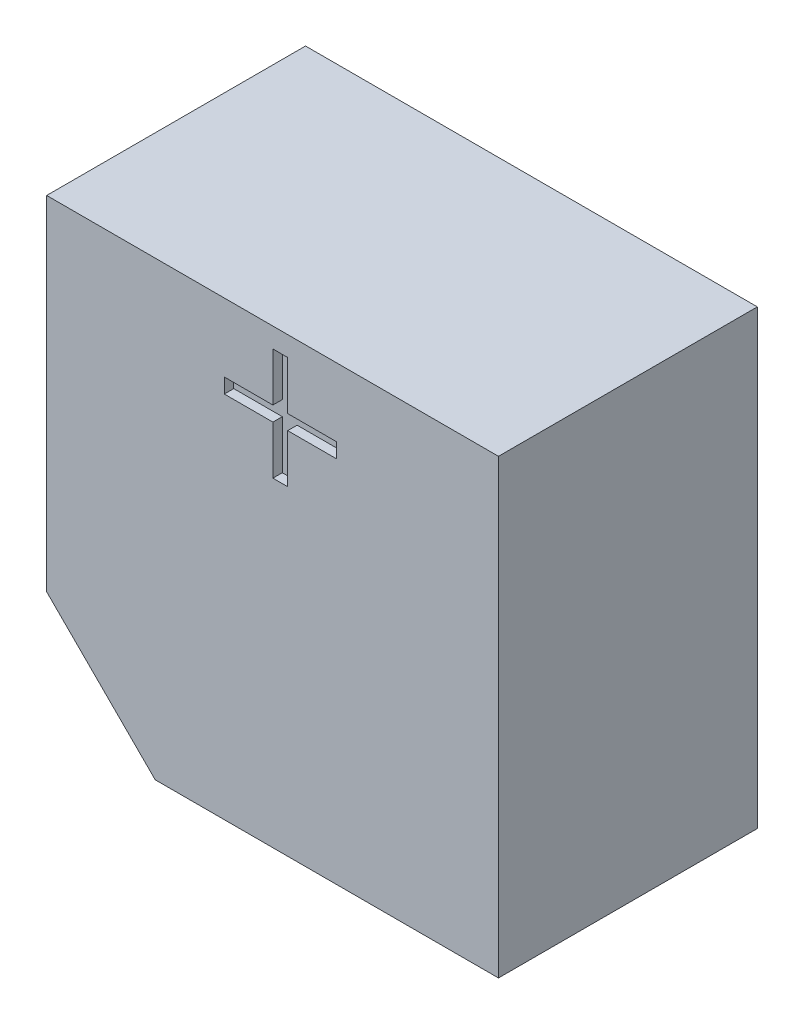
ISO-10303-21;
HEADER;
FILE_DESCRIPTION(('STEP AP214'),'2;1');
FILE_NAME('part.step','',(''),(''),'','','');
FILE_SCHEMA(('AUTOMOTIVE_DESIGN { 1 0 10303 214 1 1 1 1 }'));
ENDSEC;
DATA;
#1=APPLICATION_CONTEXT('core data for automotive mechanical design processes');
#2=APPLICATION_PROTOCOL_DEFINITION('international standard','automotive_design',2000,#1);
#3=PRODUCT_CONTEXT('',#1,'mechanical');
#4=PRODUCT('Part','Part','',(#3));
#5=PRODUCT_RELATED_PRODUCT_CATEGORY('part','',(#4));
#6=PRODUCT_DEFINITION_FORMATION('','',#4);
#7=PRODUCT_DEFINITION_CONTEXT('part definition',#1,'design');
#8=PRODUCT_DEFINITION('design','',#6,#7);
#9=PRODUCT_DEFINITION_SHAPE('','',#8);
#10=(LENGTH_UNIT() NAMED_UNIT(*) SI_UNIT(.MILLI.,.METRE.));
#11=(NAMED_UNIT(*) PLANE_ANGLE_UNIT() SI_UNIT($,.RADIAN.));
#12=(NAMED_UNIT(*) SI_UNIT($,.STERADIAN.) SOLID_ANGLE_UNIT());
#13=UNCERTAINTY_MEASURE_WITH_UNIT(LENGTH_MEASURE(1.E-05),#10,'distance_accuracy_value','');
#14=(GEOMETRIC_REPRESENTATION_CONTEXT(3) GLOBAL_UNCERTAINTY_ASSIGNED_CONTEXT((#13)) GLOBAL_UNIT_ASSIGNED_CONTEXT((#10,
#11,#12)) REPRESENTATION_CONTEXT('',''));
#15=CARTESIAN_POINT('',(0.,0.,0.));
#16=DIRECTION('',(0.,0.,1.));
#17=DIRECTION('',(1.,0.,0.));
#18=AXIS2_PLACEMENT_3D('',#15,#16,#17);
#19=CARTESIAN_POINT('',(0.,0.,5.5));
#20=DIRECTION('',(0.,0.,-1.));
#21=DIRECTION('',(-1.,0.,0.));
#22=AXIS2_PLACEMENT_3D('',#19,#20,#21);
#23=PLANE('',#22);
#24=DIRECTION('',(0.,-1.,0.));
#25=VECTOR('',#24,1.);
#26=CARTESIAN_POINT('',(0.,2.30644055829738,5.5));
#27=LINE('',#26,#25);
#28=CARTESIAN_POINT('',(0.,9.6,5.5));
#29=VERTEX_POINT('',#28);
#30=CARTESIAN_POINT('',(0.,2.30644055829738,5.5));
#31=VERTEX_POINT('',#30);
#32=EDGE_CURVE('E130',#29,#31,#27,.T.);
#33=ORIENTED_EDGE('',*,*,#32,.T.);
#34=DIRECTION('',(0.707106781186557,-0.707106781186538,0.));
#35=VECTOR('',#34,1.);
#36=CARTESIAN_POINT('',(2.30644055829744,0.,5.5));
#37=LINE('',#36,#35);
#38=CARTESIAN_POINT('',(2.30644055829744,0.,5.5));
#39=VERTEX_POINT('',#38);
#40=EDGE_CURVE('E89',#31,#39,#37,.T.);
#41=ORIENTED_EDGE('',*,*,#40,.T.);
#42=DIRECTION('',(1.,0.,0.));
#43=VECTOR('',#42,1.);
#44=CARTESIAN_POINT('',(9.6,0.,5.5));
#45=LINE('',#44,#43);
#46=CARTESIAN_POINT('',(9.6,0.,5.5));
#47=VERTEX_POINT('',#46);
#48=EDGE_CURVE('E96',#39,#47,#45,.T.);
#49=ORIENTED_EDGE('',*,*,#48,.T.);
#50=DIRECTION('',(0.,1.,0.));
#51=VECTOR('',#50,1.);
#52=CARTESIAN_POINT('',(9.6,9.6,5.5));
#53=LINE('',#52,#51);
#54=CARTESIAN_POINT('',(9.6,9.6,5.5));
#55=VERTEX_POINT('',#54);
#56=EDGE_CURVE('E100',#47,#55,#53,.T.);
#57=ORIENTED_EDGE('',*,*,#56,.T.);
#58=DIRECTION('',(-1.,0.,0.));
#59=VECTOR('',#58,1.);
#60=CARTESIAN_POINT('',(0.,9.6,5.5));
#61=LINE('',#60,#59);
#62=EDGE_CURVE('E57',#55,#29,#61,.T.);
#63=ORIENTED_EDGE('',*,*,#62,.T.);
#64=EDGE_LOOP('',(#33,#41,#49,#57,#63));
#65=FACE_BOUND('',#64,.T.);
#66=DIRECTION('',(1.,0.,0.));
#67=VECTOR('',#66,1.);
#68=CARTESIAN_POINT('',(3.77491866422348,8.1469391570996,5.5));
#69=LINE('',#68,#67);
#70=CARTESIAN_POINT('',(3.77491866422348,8.1469391570996,5.5));
#71=VERTEX_POINT('',#70);
#72=CARTESIAN_POINT('',(4.80696994627476,8.1469391570996,5.5));
#73=VERTEX_POINT('',#72);
#74=EDGE_CURVE('E48',#71,#73,#69,.T.);
#75=ORIENTED_EDGE('',*,*,#74,.T.);
#76=DIRECTION('',(0.,1.,0.));
#77=VECTOR('',#76,1.);
#78=CARTESIAN_POINT('',(4.80696994627476,8.1469391570996,5.5));
#79=LINE('',#78,#77);
#80=CARTESIAN_POINT('',(4.80696994627476,9.17899043915089,5.5));
#81=VERTEX_POINT('',#80);
#82=EDGE_CURVE('E206',#73,#81,#79,.T.);
#83=ORIENTED_EDGE('',*,*,#82,.T.);
#84=DIRECTION('',(1.,0.,0.));
#85=VECTOR('',#84,1.);
#86=CARTESIAN_POINT('',(4.80696994627476,9.17899043915089,5.5));
#87=LINE('',#86,#85);
#88=CARTESIAN_POINT('',(5.12107251037732,9.17899043915089,5.5));
#89=VERTEX_POINT('',#88);
#90=EDGE_CURVE('E203',#81,#89,#87,.T.);
#91=ORIENTED_EDGE('',*,*,#90,.T.);
#92=DIRECTION('',(0.,-1.,0.));
#93=VECTOR('',#92,1.);
#94=CARTESIAN_POINT('',(5.12107251037732,9.17899043915089,5.5));
#95=LINE('',#94,#93);
#96=CARTESIAN_POINT('',(5.12107251037732,8.1469391570996,5.5));
#97=VERTEX_POINT('',#96);
#98=EDGE_CURVE('E200',#89,#97,#95,.T.);
#99=ORIENTED_EDGE('',*,*,#98,.T.);
#100=DIRECTION('',(1.,0.,0.));
#101=VECTOR('',#100,1.);
#102=CARTESIAN_POINT('',(5.12107251037732,8.1469391570996,5.5));
#103=LINE('',#102,#101);
#104=CARTESIAN_POINT('',(6.15312379242861,8.1469391570996,5.5));
#105=VERTEX_POINT('',#104);
#106=EDGE_CURVE('E197',#97,#105,#103,.T.);
#107=ORIENTED_EDGE('',*,*,#106,.T.);
#108=DIRECTION('',(0.,-1.,0.));
#109=VECTOR('',#108,1.);
#110=CARTESIAN_POINT('',(6.15312379242861,8.1469391570996,5.5));
#111=LINE('',#110,#109);
#112=CARTESIAN_POINT('',(6.15312379242861,7.83283659299704,5.5));
#113=VERTEX_POINT('',#112);
#114=EDGE_CURVE('E194',#105,#113,#111,.T.);
#115=ORIENTED_EDGE('',*,*,#114,.T.);
#116=DIRECTION('',(-1.,0.,0.));
#117=VECTOR('',#116,1.);
#118=CARTESIAN_POINT('',(6.15312379242861,7.83283659299704,5.5));
#119=LINE('',#118,#117);
#120=CARTESIAN_POINT('',(5.12107251037732,7.83283659299704,5.5));
#121=VERTEX_POINT('',#120);
#122=EDGE_CURVE('E191',#113,#121,#119,.T.);
#123=ORIENTED_EDGE('',*,*,#122,.T.);
#124=DIRECTION('',(0.,-1.,0.));
#125=VECTOR('',#124,1.);
#126=CARTESIAN_POINT('',(5.12107251037732,7.83283659299704,5.5));
#127=LINE('',#126,#125);
#128=CARTESIAN_POINT('',(5.12107251037732,6.80078531094576,5.5));
#129=VERTEX_POINT('',#128);
#130=EDGE_CURVE('E188',#121,#129,#127,.T.);
#131=ORIENTED_EDGE('',*,*,#130,.T.);
#132=DIRECTION('',(-1.,0.,0.));
#133=VECTOR('',#132,1.);
#134=CARTESIAN_POINT('',(5.12107251037732,6.80078531094576,5.5));
#135=LINE('',#134,#133);
#136=CARTESIAN_POINT('',(4.80696994627476,6.80078531094576,5.5));
#137=VERTEX_POINT('',#136);
#138=EDGE_CURVE('E185',#129,#137,#135,.T.);
#139=ORIENTED_EDGE('',*,*,#138,.T.);
#140=DIRECTION('',(0.,1.,0.));
#141=VECTOR('',#140,1.);
#142=CARTESIAN_POINT('',(4.80696994627476,6.80078531094576,5.5));
#143=LINE('',#142,#141);
#144=CARTESIAN_POINT('',(4.80696994627476,7.83283659299704,5.5));
#145=VERTEX_POINT('',#144);
#146=EDGE_CURVE('E182',#137,#145,#143,.T.);
#147=ORIENTED_EDGE('',*,*,#146,.T.);
#148=DIRECTION('',(-1.,0.,0.));
#149=VECTOR('',#148,1.);
#150=CARTESIAN_POINT('',(4.80696994627476,7.83283659299704,5.5));
#151=LINE('',#150,#149);
#152=CARTESIAN_POINT('',(3.77491866422348,7.83283659299704,5.5));
#153=VERTEX_POINT('',#152);
#154=EDGE_CURVE('E179',#145,#153,#151,.T.);
#155=ORIENTED_EDGE('',*,*,#154,.T.);
#156=DIRECTION('',(0.,1.,0.));
#157=VECTOR('',#156,1.);
#158=CARTESIAN_POINT('',(3.77491866422348,7.83283659299704,5.5));
#159=LINE('',#158,#157);
#160=EDGE_CURVE('E175',#153,#71,#159,.T.);
#161=ORIENTED_EDGE('',*,*,#160,.T.);
#162=EDGE_LOOP('',(#75,#83,#91,#99,#107,#115,#123,#131,#139,#147,#155,#161));
#163=FACE_BOUND('',#162,.T.);
#164=ADVANCED_FACE('F33',(#65,#163),#23,.F.);
#165=CARTESIAN_POINT('',(0.,2.30644055829738,5.5));
#166=DIRECTION('',(1.,0.,0.));
#167=DIRECTION('',(0.,1.,0.));
#168=AXIS2_PLACEMENT_3D('',#165,#166,#167);
#169=PLANE('',#168);
#170=DIRECTION('',(0.,-1.,0.));
#171=VECTOR('',#170,1.);
#172=CARTESIAN_POINT('',(0.,2.30644055829738,0.));
#173=LINE('',#172,#171);
#174=CARTESIAN_POINT('',(0.,9.6,0.));
#175=VERTEX_POINT('',#174);
#176=CARTESIAN_POINT('',(0.,2.30644055829738,0.));
#177=VERTEX_POINT('',#176);
#178=EDGE_CURVE('E120',#175,#177,#173,.T.);
#179=ORIENTED_EDGE('',*,*,#178,.T.);
#180=DIRECTION('',(0.,0.,-1.));
#181=VECTOR('',#180,1.);
#182=CARTESIAN_POINT('',(0.,2.30644055829738,5.5));
#183=LINE('',#182,#181);
#184=EDGE_CURVE('E11',#31,#177,#183,.T.);
#185=ORIENTED_EDGE('',*,*,#184,.F.);
#186=ORIENTED_EDGE('',*,*,#32,.F.);
#187=DIRECTION('',(0.,0.,-1.));
#188=VECTOR('',#187,1.);
#189=CARTESIAN_POINT('',(0.,9.6,5.5));
#190=LINE('',#189,#188);
#191=EDGE_CURVE('E116',#29,#175,#190,.T.);
#192=ORIENTED_EDGE('',*,*,#191,.T.);
#193=EDGE_LOOP('',(#179,#185,#186,#192));
#194=FACE_BOUND('',#193,.T.);
#195=ADVANCED_FACE('F35',(#194),#169,.F.);
#196=CARTESIAN_POINT('',(2.30644055829744,0.,5.5));
#197=DIRECTION('',(0.707106781186538,0.707106781186557,0.));
#198=DIRECTION('',(-0.707106781186557,0.707106781186538,0.));
#199=AXIS2_PLACEMENT_3D('',#196,#197,#198);
#200=PLANE('',#199);
#201=DIRECTION('',(0.707106781186557,-0.707106781186538,0.));
#202=VECTOR('',#201,1.);
#203=CARTESIAN_POINT('',(2.30644055829744,0.,0.));
#204=LINE('',#203,#202);
#205=CARTESIAN_POINT('',(2.30644055829744,0.,0.));
#206=VERTEX_POINT('',#205);
#207=EDGE_CURVE('E123',#177,#206,#204,.T.);
#208=ORIENTED_EDGE('',*,*,#207,.T.);
#209=DIRECTION('',(0.,0.,-1.));
#210=VECTOR('',#209,1.);
#211=CARTESIAN_POINT('',(2.30644055829744,0.,5.5));
#212=LINE('',#211,#210);
#213=EDGE_CURVE('E41',#39,#206,#212,.T.);
#214=ORIENTED_EDGE('',*,*,#213,.F.);
#215=ORIENTED_EDGE('',*,*,#40,.F.);
#216=ORIENTED_EDGE('',*,*,#184,.T.);
#217=EDGE_LOOP('',(#208,#214,#215,#216));
#218=FACE_BOUND('',#217,.T.);
#219=ADVANCED_FACE('F357',(#218),#200,.F.);
#220=CARTESIAN_POINT('',(9.6,0.,5.5));
#221=DIRECTION('',(0.,1.,0.));
#222=DIRECTION('',(0.,0.,1.));
#223=AXIS2_PLACEMENT_3D('',#220,#221,#222);
#224=PLANE('',#223);
#225=DIRECTION('',(1.,0.,0.));
#226=VECTOR('',#225,1.);
#227=CARTESIAN_POINT('',(9.6,0.,0.));
#228=LINE('',#227,#226);
#229=CARTESIAN_POINT('',(9.6,0.,0.));
#230=VERTEX_POINT('',#229);
#231=EDGE_CURVE('E109',#206,#230,#228,.T.);
#232=ORIENTED_EDGE('',*,*,#231,.T.);
#233=DIRECTION('',(0.,0.,-1.));
#234=VECTOR('',#233,1.);
#235=CARTESIAN_POINT('',(9.6,0.,5.5));
#236=LINE('',#235,#234);
#237=EDGE_CURVE('E106',#47,#230,#236,.T.);
#238=ORIENTED_EDGE('',*,*,#237,.F.);
#239=ORIENTED_EDGE('',*,*,#48,.F.);
#240=ORIENTED_EDGE('',*,*,#213,.T.);
#241=EDGE_LOOP('',(#232,#238,#239,#240));
#242=FACE_BOUND('',#241,.T.);
#243=ADVANCED_FACE('F107',(#242),#224,.F.);
#244=CARTESIAN_POINT('',(9.6,9.6,5.5));
#245=DIRECTION('',(-1.,0.,0.));
#246=DIRECTION('',(0.,0.,1.));
#247=AXIS2_PLACEMENT_3D('',#244,#245,#246);
#248=PLANE('',#247);
#249=DIRECTION('',(0.,1.,0.));
#250=VECTOR('',#249,1.);
#251=CARTESIAN_POINT('',(9.6,9.6,0.));
#252=LINE('',#251,#250);
#253=CARTESIAN_POINT('',(9.6,9.6,0.));
#254=VERTEX_POINT('',#253);
#255=EDGE_CURVE('E127',#230,#254,#252,.T.);
#256=ORIENTED_EDGE('',*,*,#255,.T.);
#257=DIRECTION('',(0.,0.,-1.));
#258=VECTOR('',#257,1.);
#259=CARTESIAN_POINT('',(9.6,9.6,5.5));
#260=LINE('',#259,#258);
#261=EDGE_CURVE('E112',#55,#254,#260,.T.);
#262=ORIENTED_EDGE('',*,*,#261,.F.);
#263=ORIENTED_EDGE('',*,*,#56,.F.);
#264=ORIENTED_EDGE('',*,*,#237,.T.);
#265=EDGE_LOOP('',(#256,#262,#263,#264));
#266=FACE_BOUND('',#265,.T.);
#267=ADVANCED_FACE('F114',(#266),#248,.F.);
#268=CARTESIAN_POINT('',(0.,9.6,5.5));
#269=DIRECTION('',(0.,-1.,0.));
#270=DIRECTION('',(0.,0.,-1.));
#271=AXIS2_PLACEMENT_3D('',#268,#269,#270);
#272=PLANE('',#271);
#273=DIRECTION('',(-1.,0.,0.));
#274=VECTOR('',#273,1.);
#275=CARTESIAN_POINT('',(0.,9.6,0.));
#276=LINE('',#275,#274);
#277=EDGE_CURVE('E81',#254,#175,#276,.T.);
#278=ORIENTED_EDGE('',*,*,#277,.T.);
#279=ORIENTED_EDGE('',*,*,#191,.F.);
#280=ORIENTED_EDGE('',*,*,#62,.F.);
#281=ORIENTED_EDGE('',*,*,#261,.T.);
#282=EDGE_LOOP('',(#278,#279,#280,#281));
#283=FACE_BOUND('',#282,.T.);
#284=ADVANCED_FACE('F135',(#283),#272,.F.);
#285=CARTESIAN_POINT('',(0.,0.,0.));
#286=DIRECTION('',(0.,0.,-1.));
#287=DIRECTION('',(-1.,0.,0.));
#288=AXIS2_PLACEMENT_3D('',#285,#286,#287);
#289=PLANE('',#288);
#290=ORIENTED_EDGE('',*,*,#178,.F.);
#291=ORIENTED_EDGE('',*,*,#277,.F.);
#292=ORIENTED_EDGE('',*,*,#255,.F.);
#293=ORIENTED_EDGE('',*,*,#231,.F.);
#294=ORIENTED_EDGE('',*,*,#207,.F.);
#295=EDGE_LOOP('',(#290,#291,#292,#293,#294));
#296=FACE_BOUND('',#295,.T.);
#297=ADVANCED_FACE('F134',(#296),#289,.T.);
#298=CARTESIAN_POINT('',(3.77491866422348,8.1469391570996,5.3));
#299=DIRECTION('',(0.,-1.,0.));
#300=DIRECTION('',(0.,0.,-1.));
#301=AXIS2_PLACEMENT_3D('',#298,#299,#300);
#302=PLANE('',#301);
#303=ORIENTED_EDGE('',*,*,#74,.F.);
#304=DIRECTION('',(0.,0.,1.));
#305=VECTOR('',#304,1.);
#306=CARTESIAN_POINT('',(3.77491866422348,8.1469391570996,5.3));
#307=LINE('',#306,#305);
#308=CARTESIAN_POINT('',(3.77491866422348,8.1469391570996,5.3));
#309=VERTEX_POINT('',#308);
#310=EDGE_CURVE('E172',#309,#71,#307,.T.);
#311=ORIENTED_EDGE('',*,*,#310,.F.);
#312=DIRECTION('',(1.,0.,0.));
#313=VECTOR('',#312,1.);
#314=CARTESIAN_POINT('',(3.77491866422348,8.1469391570996,5.3));
#315=LINE('',#314,#313);
#316=CARTESIAN_POINT('',(4.80696994627476,8.1469391570996,5.3));
#317=VERTEX_POINT('',#316);
#318=EDGE_CURVE('E178',#309,#317,#315,.T.);
#319=ORIENTED_EDGE('',*,*,#318,.T.);
#320=DIRECTION('',(0.,0.,1.));
#321=VECTOR('',#320,1.);
#322=CARTESIAN_POINT('',(4.80696994627476,8.1469391570996,5.3));
#323=LINE('',#322,#321);
#324=EDGE_CURVE('E124',#317,#73,#323,.T.);
#325=ORIENTED_EDGE('',*,*,#324,.T.);
#326=EDGE_LOOP('',(#303,#311,#319,#325));
#327=FACE_BOUND('',#326,.T.);
#328=ADVANCED_FACE('F246',(#327),#302,.T.);
#329=CARTESIAN_POINT('',(4.80696994627476,8.1469391570996,5.3));
#330=DIRECTION('',(1.,0.,0.));
#331=DIRECTION('',(0.,0.,-1.));
#332=AXIS2_PLACEMENT_3D('',#329,#330,#331);
#333=PLANE('',#332);
#334=ORIENTED_EDGE('',*,*,#82,.F.);
#335=ORIENTED_EDGE('',*,*,#324,.F.);
#336=DIRECTION('',(0.,1.,0.));
#337=VECTOR('',#336,1.);
#338=CARTESIAN_POINT('',(4.80696994627476,8.1469391570996,5.3));
#339=LINE('',#338,#337);
#340=CARTESIAN_POINT('',(4.80696994627476,9.17899043915089,5.3));
#341=VERTEX_POINT('',#340);
#342=EDGE_CURVE('E239',#317,#341,#339,.T.);
#343=ORIENTED_EDGE('',*,*,#342,.T.);
#344=DIRECTION('',(0.,0.,1.));
#345=VECTOR('',#344,1.);
#346=CARTESIAN_POINT('',(4.80696994627476,9.17899043915089,5.3));
#347=LINE('',#346,#345);
#348=EDGE_CURVE('E142',#341,#81,#347,.T.);
#349=ORIENTED_EDGE('',*,*,#348,.T.);
#350=EDGE_LOOP('',(#334,#335,#343,#349));
#351=FACE_BOUND('',#350,.T.);
#352=ADVANCED_FACE('F255',(#351),#333,.T.);
#353=CARTESIAN_POINT('',(4.80696994627476,9.17899043915089,5.3));
#354=DIRECTION('',(0.,-1.,0.));
#355=DIRECTION('',(0.,0.,-1.));
#356=AXIS2_PLACEMENT_3D('',#353,#354,#355);
#357=PLANE('',#356);
#358=ORIENTED_EDGE('',*,*,#90,.F.);
#359=ORIENTED_EDGE('',*,*,#348,.F.);
#360=DIRECTION('',(1.,0.,0.));
#361=VECTOR('',#360,1.);
#362=CARTESIAN_POINT('',(4.80696994627476,9.17899043915089,5.3));
#363=LINE('',#362,#361);
#364=CARTESIAN_POINT('',(5.12107251037732,9.17899043915089,5.3));
#365=VERTEX_POINT('',#364);
#366=EDGE_CURVE('E236',#341,#365,#363,.T.);
#367=ORIENTED_EDGE('',*,*,#366,.T.);
#368=DIRECTION('',(0.,0.,1.));
#369=VECTOR('',#368,1.);
#370=CARTESIAN_POINT('',(5.12107251037732,9.17899043915089,5.3));
#371=LINE('',#370,#369);
#372=EDGE_CURVE('E145',#365,#89,#371,.T.);
#373=ORIENTED_EDGE('',*,*,#372,.T.);
#374=EDGE_LOOP('',(#358,#359,#367,#373));
#375=FACE_BOUND('',#374,.T.);
#376=ADVANCED_FACE('F318',(#375),#357,.T.);
#377=CARTESIAN_POINT('',(5.12107251037732,9.17899043915089,5.3));
#378=DIRECTION('',(-1.,0.,0.));
#379=DIRECTION('',(0.,0.,1.));
#380=AXIS2_PLACEMENT_3D('',#377,#378,#379);
#381=PLANE('',#380);
#382=ORIENTED_EDGE('',*,*,#98,.F.);
#383=ORIENTED_EDGE('',*,*,#372,.F.);
#384=DIRECTION('',(0.,-1.,0.));
#385=VECTOR('',#384,1.);
#386=CARTESIAN_POINT('',(5.12107251037732,9.17899043915089,5.3));
#387=LINE('',#386,#385);
#388=CARTESIAN_POINT('',(5.12107251037732,8.1469391570996,5.3));
#389=VERTEX_POINT('',#388);
#390=EDGE_CURVE('E233',#365,#389,#387,.T.);
#391=ORIENTED_EDGE('',*,*,#390,.T.);
#392=DIRECTION('',(0.,0.,1.));
#393=VECTOR('',#392,1.);
#394=CARTESIAN_POINT('',(5.12107251037732,8.1469391570996,5.3));
#395=LINE('',#394,#393);
#396=EDGE_CURVE('E148',#389,#97,#395,.T.);
#397=ORIENTED_EDGE('',*,*,#396,.T.);
#398=EDGE_LOOP('',(#382,#383,#391,#397));
#399=FACE_BOUND('',#398,.T.);
#400=ADVANCED_FACE('F322',(#399),#381,.T.);
#401=CARTESIAN_POINT('',(5.12107251037732,8.1469391570996,5.3));
#402=DIRECTION('',(0.,-1.,0.));
#403=DIRECTION('',(0.,0.,-1.));
#404=AXIS2_PLACEMENT_3D('',#401,#402,#403);
#405=PLANE('',#404);
#406=ORIENTED_EDGE('',*,*,#106,.F.);
#407=ORIENTED_EDGE('',*,*,#396,.F.);
#408=DIRECTION('',(1.,0.,0.));
#409=VECTOR('',#408,1.);
#410=CARTESIAN_POINT('',(5.12107251037732,8.1469391570996,5.3));
#411=LINE('',#410,#409);
#412=CARTESIAN_POINT('',(6.15312379242861,8.1469391570996,5.3));
#413=VERTEX_POINT('',#412);
#414=EDGE_CURVE('E230',#389,#413,#411,.T.);
#415=ORIENTED_EDGE('',*,*,#414,.T.);
#416=DIRECTION('',(0.,0.,1.));
#417=VECTOR('',#416,1.);
#418=CARTESIAN_POINT('',(6.15312379242861,8.1469391570996,5.3));
#419=LINE('',#418,#417);
#420=EDGE_CURVE('E151',#413,#105,#419,.T.);
#421=ORIENTED_EDGE('',*,*,#420,.T.);
#422=EDGE_LOOP('',(#406,#407,#415,#421));
#423=FACE_BOUND('',#422,.T.);
#424=ADVANCED_FACE('F330',(#423),#405,.T.);
#425=CARTESIAN_POINT('',(6.15312379242861,8.1469391570996,5.3));
#426=DIRECTION('',(-1.,0.,0.));
#427=DIRECTION('',(0.,0.,1.));
#428=AXIS2_PLACEMENT_3D('',#425,#426,#427);
#429=PLANE('',#428);
#430=ORIENTED_EDGE('',*,*,#114,.F.);
#431=ORIENTED_EDGE('',*,*,#420,.F.);
#432=DIRECTION('',(0.,-1.,0.));
#433=VECTOR('',#432,1.);
#434=CARTESIAN_POINT('',(6.15312379242861,8.1469391570996,5.3));
#435=LINE('',#434,#433);
#436=CARTESIAN_POINT('',(6.15312379242861,7.83283659299704,5.3));
#437=VERTEX_POINT('',#436);
#438=EDGE_CURVE('E227',#413,#437,#435,.T.);
#439=ORIENTED_EDGE('',*,*,#438,.T.);
#440=DIRECTION('',(0.,0.,1.));
#441=VECTOR('',#440,1.);
#442=CARTESIAN_POINT('',(6.15312379242861,7.83283659299704,5.3));
#443=LINE('',#442,#441);
#444=EDGE_CURVE('E154',#437,#113,#443,.T.);
#445=ORIENTED_EDGE('',*,*,#444,.T.);
#446=EDGE_LOOP('',(#430,#431,#439,#445));
#447=FACE_BOUND('',#446,.T.);
#448=ADVANCED_FACE('F333',(#447),#429,.T.);
#449=CARTESIAN_POINT('',(6.15312379242861,7.83283659299704,5.3));
#450=DIRECTION('',(0.,1.,0.));
#451=DIRECTION('',(0.,0.,1.));
#452=AXIS2_PLACEMENT_3D('',#449,#450,#451);
#453=PLANE('',#452);
#454=ORIENTED_EDGE('',*,*,#122,.F.);
#455=ORIENTED_EDGE('',*,*,#444,.F.);
#456=DIRECTION('',(-1.,0.,0.));
#457=VECTOR('',#456,1.);
#458=CARTESIAN_POINT('',(6.15312379242861,7.83283659299704,5.3));
#459=LINE('',#458,#457);
#460=CARTESIAN_POINT('',(5.12107251037732,7.83283659299704,5.3));
#461=VERTEX_POINT('',#460);
#462=EDGE_CURVE('E224',#437,#461,#459,.T.);
#463=ORIENTED_EDGE('',*,*,#462,.T.);
#464=DIRECTION('',(0.,0.,1.));
#465=VECTOR('',#464,1.);
#466=CARTESIAN_POINT('',(5.12107251037732,7.83283659299704,5.3));
#467=LINE('',#466,#465);
#468=EDGE_CURVE('E157',#461,#121,#467,.T.);
#469=ORIENTED_EDGE('',*,*,#468,.T.);
#470=EDGE_LOOP('',(#454,#455,#463,#469));
#471=FACE_BOUND('',#470,.T.);
#472=ADVANCED_FACE('F338',(#471),#453,.T.);
#473=CARTESIAN_POINT('',(5.12107251037732,7.83283659299704,5.3));
#474=DIRECTION('',(-1.,0.,0.));
#475=DIRECTION('',(0.,0.,1.));
#476=AXIS2_PLACEMENT_3D('',#473,#474,#475);
#477=PLANE('',#476);
#478=ORIENTED_EDGE('',*,*,#130,.F.);
#479=ORIENTED_EDGE('',*,*,#468,.F.);
#480=DIRECTION('',(0.,-1.,0.));
#481=VECTOR('',#480,1.);
#482=CARTESIAN_POINT('',(5.12107251037732,7.83283659299704,5.3));
#483=LINE('',#482,#481);
#484=CARTESIAN_POINT('',(5.12107251037732,6.80078531094576,5.3));
#485=VERTEX_POINT('',#484);
#486=EDGE_CURVE('E221',#461,#485,#483,.T.);
#487=ORIENTED_EDGE('',*,*,#486,.T.);
#488=DIRECTION('',(0.,0.,1.));
#489=VECTOR('',#488,1.);
#490=CARTESIAN_POINT('',(5.12107251037732,6.80078531094576,5.3));
#491=LINE('',#490,#489);
#492=EDGE_CURVE('E160',#485,#129,#491,.T.);
#493=ORIENTED_EDGE('',*,*,#492,.T.);
#494=EDGE_LOOP('',(#478,#479,#487,#493));
#495=FACE_BOUND('',#494,.T.);
#496=ADVANCED_FACE('F341',(#495),#477,.T.);
#497=CARTESIAN_POINT('',(5.12107251037732,6.80078531094576,5.3));
#498=DIRECTION('',(0.,1.,0.));
#499=DIRECTION('',(0.,0.,1.));
#500=AXIS2_PLACEMENT_3D('',#497,#498,#499);
#501=PLANE('',#500);
#502=ORIENTED_EDGE('',*,*,#138,.F.);
#503=ORIENTED_EDGE('',*,*,#492,.F.);
#504=DIRECTION('',(-1.,0.,0.));
#505=VECTOR('',#504,1.);
#506=CARTESIAN_POINT('',(5.12107251037732,6.80078531094576,5.3));
#507=LINE('',#506,#505);
#508=CARTESIAN_POINT('',(4.80696994627476,6.80078531094576,5.3));
#509=VERTEX_POINT('',#508);
#510=EDGE_CURVE('E218',#485,#509,#507,.T.);
#511=ORIENTED_EDGE('',*,*,#510,.T.);
#512=DIRECTION('',(0.,0.,1.));
#513=VECTOR('',#512,1.);
#514=CARTESIAN_POINT('',(4.80696994627476,6.80078531094576,5.3));
#515=LINE('',#514,#513);
#516=EDGE_CURVE('E163',#509,#137,#515,.T.);
#517=ORIENTED_EDGE('',*,*,#516,.T.);
#518=EDGE_LOOP('',(#502,#503,#511,#517));
#519=FACE_BOUND('',#518,.T.);
#520=ADVANCED_FACE('F343',(#519),#501,.T.);
#521=CARTESIAN_POINT('',(4.80696994627476,6.80078531094576,5.3));
#522=DIRECTION('',(1.,0.,0.));
#523=DIRECTION('',(0.,0.,-1.));
#524=AXIS2_PLACEMENT_3D('',#521,#522,#523);
#525=PLANE('',#524);
#526=ORIENTED_EDGE('',*,*,#146,.F.);
#527=ORIENTED_EDGE('',*,*,#516,.F.);
#528=DIRECTION('',(0.,1.,0.));
#529=VECTOR('',#528,1.);
#530=CARTESIAN_POINT('',(4.80696994627476,6.80078531094576,5.3));
#531=LINE('',#530,#529);
#532=CARTESIAN_POINT('',(4.80696994627476,7.83283659299704,5.3));
#533=VERTEX_POINT('',#532);
#534=EDGE_CURVE('E215',#509,#533,#531,.T.);
#535=ORIENTED_EDGE('',*,*,#534,.T.);
#536=DIRECTION('',(0.,0.,1.));
#537=VECTOR('',#536,1.);
#538=CARTESIAN_POINT('',(4.80696994627476,7.83283659299704,5.3));
#539=LINE('',#538,#537);
#540=EDGE_CURVE('E166',#533,#145,#539,.T.);
#541=ORIENTED_EDGE('',*,*,#540,.T.);
#542=EDGE_LOOP('',(#526,#527,#535,#541));
#543=FACE_BOUND('',#542,.T.);
#544=ADVANCED_FACE('F291',(#543),#525,.T.);
#545=CARTESIAN_POINT('',(4.80696994627476,7.83283659299704,5.3));
#546=DIRECTION('',(0.,1.,0.));
#547=DIRECTION('',(0.,0.,1.));
#548=AXIS2_PLACEMENT_3D('',#545,#546,#547);
#549=PLANE('',#548);
#550=ORIENTED_EDGE('',*,*,#154,.F.);
#551=ORIENTED_EDGE('',*,*,#540,.F.);
#552=DIRECTION('',(-1.,0.,0.));
#553=VECTOR('',#552,1.);
#554=CARTESIAN_POINT('',(4.80696994627476,7.83283659299704,5.3));
#555=LINE('',#554,#553);
#556=CARTESIAN_POINT('',(3.77491866422348,7.83283659299704,5.3));
#557=VERTEX_POINT('',#556);
#558=EDGE_CURVE('E212',#533,#557,#555,.T.);
#559=ORIENTED_EDGE('',*,*,#558,.T.);
#560=DIRECTION('',(0.,0.,1.));
#561=VECTOR('',#560,1.);
#562=CARTESIAN_POINT('',(3.77491866422348,7.83283659299704,5.3));
#563=LINE('',#562,#561);
#564=EDGE_CURVE('E169',#557,#153,#563,.T.);
#565=ORIENTED_EDGE('',*,*,#564,.T.);
#566=EDGE_LOOP('',(#550,#551,#559,#565));
#567=FACE_BOUND('',#566,.T.);
#568=ADVANCED_FACE('F284',(#567),#549,.T.);
#569=CARTESIAN_POINT('',(3.77491866422348,7.83283659299704,5.3));
#570=DIRECTION('',(1.,0.,0.));
#571=DIRECTION('',(0.,0.,-1.));
#572=AXIS2_PLACEMENT_3D('',#569,#570,#571);
#573=PLANE('',#572);
#574=ORIENTED_EDGE('',*,*,#160,.F.);
#575=ORIENTED_EDGE('',*,*,#564,.F.);
#576=DIRECTION('',(0.,1.,0.));
#577=VECTOR('',#576,1.);
#578=CARTESIAN_POINT('',(3.77491866422348,7.83283659299704,5.3));
#579=LINE('',#578,#577);
#580=EDGE_CURVE('E174',#557,#309,#579,.T.);
#581=ORIENTED_EDGE('',*,*,#580,.T.);
#582=ORIENTED_EDGE('',*,*,#310,.T.);
#583=EDGE_LOOP('',(#574,#575,#581,#582));
#584=FACE_BOUND('',#583,.T.);
#585=ADVANCED_FACE('F288',(#584),#573,.T.);
#586=CARTESIAN_POINT('',(0.,0.,5.3));
#587=DIRECTION('',(0.,0.,1.));
#588=DIRECTION('',(1.,0.,0.));
#589=AXIS2_PLACEMENT_3D('',#586,#587,#588);
#590=PLANE('',#589);
#591=ORIENTED_EDGE('',*,*,#318,.F.);
#592=ORIENTED_EDGE('',*,*,#580,.F.);
#593=ORIENTED_EDGE('',*,*,#558,.F.);
#594=ORIENTED_EDGE('',*,*,#534,.F.);
#595=ORIENTED_EDGE('',*,*,#510,.F.);
#596=ORIENTED_EDGE('',*,*,#486,.F.);
#597=ORIENTED_EDGE('',*,*,#462,.F.);
#598=ORIENTED_EDGE('',*,*,#438,.F.);
#599=ORIENTED_EDGE('',*,*,#414,.F.);
#600=ORIENTED_EDGE('',*,*,#390,.F.);
#601=ORIENTED_EDGE('',*,*,#366,.F.);
#602=ORIENTED_EDGE('',*,*,#342,.F.);
#603=EDGE_LOOP('',(#591,#592,#593,#594,#595,#596,#597,#598,#599,#600,#601,#602));
#604=FACE_BOUND('',#603,.T.);
#605=ADVANCED_FACE('F299',(#604),#590,.T.);
#606=CLOSED_SHELL('',(#164,#195,#219,#243,#267,#284,#297,#328,#352,#376,#400,#424,#448,#472,
#496,#520,#544,#568,#585,#605));
#607=MANIFOLD_SOLID_BREP('B2',#606);
#608=ADVANCED_BREP_SHAPE_REPRESENTATION('',(#18,#607),#14);
#609=SHAPE_DEFINITION_REPRESENTATION(#9,#608);
ENDSEC;
END-ISO-10303-21;
